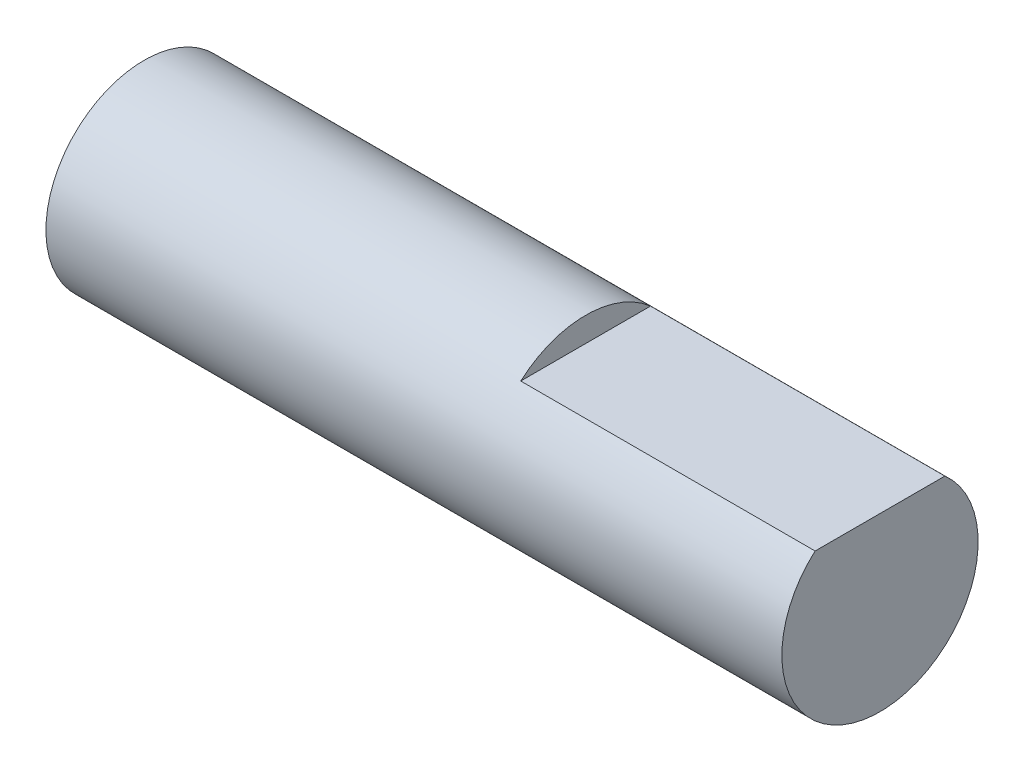
ISO-10303-21;
HEADER;
FILE_DESCRIPTION(('STEP AP214'),'2;1');
FILE_NAME('part.step','',(''),(''),'','','');
FILE_SCHEMA(('AUTOMOTIVE_DESIGN { 1 0 10303 214 1 1 1 1 }'));
ENDSEC;
DATA;
#1=APPLICATION_CONTEXT('core data for automotive mechanical design processes');
#2=APPLICATION_PROTOCOL_DEFINITION('international standard','automotive_design',2000,#1);
#3=PRODUCT_CONTEXT('',#1,'mechanical');
#4=PRODUCT('Part','Part','',(#3));
#5=PRODUCT_RELATED_PRODUCT_CATEGORY('part','',(#4));
#6=PRODUCT_DEFINITION_FORMATION('','',#4);
#7=PRODUCT_DEFINITION_CONTEXT('part definition',#1,'design');
#8=PRODUCT_DEFINITION('design','',#6,#7);
#9=PRODUCT_DEFINITION_SHAPE('','',#8);
#10=(LENGTH_UNIT() NAMED_UNIT(*) SI_UNIT(.MILLI.,.METRE.));
#11=(NAMED_UNIT(*) PLANE_ANGLE_UNIT() SI_UNIT($,.RADIAN.));
#12=(NAMED_UNIT(*) SI_UNIT($,.STERADIAN.) SOLID_ANGLE_UNIT());
#13=UNCERTAINTY_MEASURE_WITH_UNIT(LENGTH_MEASURE(1.E-05),#10,'distance_accuracy_value','');
#14=(GEOMETRIC_REPRESENTATION_CONTEXT(3) GLOBAL_UNCERTAINTY_ASSIGNED_CONTEXT((#13)) GLOBAL_UNIT_ASSIGNED_CONTEXT((#10,
#11,#12)) REPRESENTATION_CONTEXT('',''));
#15=CARTESIAN_POINT('',(0.,0.,0.));
#16=DIRECTION('',(0.,0.,1.));
#17=DIRECTION('',(1.,0.,0.));
#18=AXIS2_PLACEMENT_3D('',#15,#16,#17);
#19=CARTESIAN_POINT('',(30.,0.,0.));
#20=DIRECTION('',(-1.,0.,0.));
#21=DIRECTION('',(0.,0.,1.));
#22=AXIS2_PLACEMENT_3D('',#19,#20,#21);
#23=CYLINDRICAL_SURFACE('',#22,4.);
#24=CARTESIAN_POINT('',(30.,0.,0.));
#25=DIRECTION('',(1.,0.,0.));
#26=DIRECTION('',(0.,0.,-1.));
#27=AXIS2_PLACEMENT_3D('',#24,#25,#26);
#28=CIRCLE('',#27,4.);
#29=CARTESIAN_POINT('',(30.,3.,2.64575131106459));
#30=VERTEX_POINT('',#29);
#31=CARTESIAN_POINT('',(30.,3.,-2.64575131106459));
#32=VERTEX_POINT('',#31);
#33=EDGE_CURVE('E11',#30,#32,#28,.T.);
#34=ORIENTED_EDGE('',*,*,#33,.F.);
#35=DIRECTION('',(1.,0.,0.));
#36=VECTOR('',#35,1.);
#37=CARTESIAN_POINT('',(18.,3.,2.64575131106459));
#38=LINE('',#37,#36);
#39=CARTESIAN_POINT('',(18.,3.,2.64575131106459));
#40=VERTEX_POINT('',#39);
#41=EDGE_CURVE('E61',#40,#30,#38,.T.);
#42=ORIENTED_EDGE('',*,*,#41,.F.);
#43=CARTESIAN_POINT('',(18.,0.,0.));
#44=DIRECTION('',(1.,0.,0.));
#45=DIRECTION('',(0.,0.,1.));
#46=AXIS2_PLACEMENT_3D('',#43,#44,#45);
#47=CIRCLE('',#46,4.);
#48=CARTESIAN_POINT('',(18.,3.,-2.64575131106459));
#49=VERTEX_POINT('',#48);
#50=EDGE_CURVE('E76',#49,#40,#47,.T.);
#51=ORIENTED_EDGE('',*,*,#50,.F.);
#52=DIRECTION('',(1.,0.,0.));
#53=VECTOR('',#52,1.);
#54=CARTESIAN_POINT('',(18.,3.,-2.64575131106459));
#55=LINE('',#54,#53);
#56=EDGE_CURVE('E67',#49,#32,#55,.T.);
#57=ORIENTED_EDGE('',*,*,#56,.T.);
#58=EDGE_LOOP('',(#34,#42,#51,#57));
#59=FACE_BOUND('',#58,.T.);
#60=CARTESIAN_POINT('',(0.,0.,0.));
#61=DIRECTION('',(1.,0.,0.));
#62=DIRECTION('',(0.,0.,-1.));
#63=AXIS2_PLACEMENT_3D('',#60,#61,#62);
#64=CIRCLE('',#63,4.);
#65=CARTESIAN_POINT('',(0.,0.,-4.));
#66=VERTEX_POINT('',#65);
#67=EDGE_CURVE('E50',#66,#66,#64,.T.);
#68=ORIENTED_EDGE('',*,*,#67,.T.);
#69=EDGE_LOOP('',(#68));
#70=FACE_BOUND('',#69,.T.);
#71=ADVANCED_FACE('F47',(#59,#70),#23,.T.);
#72=CARTESIAN_POINT('',(30.,0.,0.));
#73=DIRECTION('',(1.,0.,0.));
#74=DIRECTION('',(0.,0.,-1.));
#75=AXIS2_PLACEMENT_3D('',#72,#73,#74);
#76=PLANE('',#75);
#77=DIRECTION('',(0.,0.,-1.));
#78=VECTOR('',#77,1.);
#79=CARTESIAN_POINT('',(30.,3.,2.64575131106459));
#80=LINE('',#79,#78);
#81=EDGE_CURVE('E72',#30,#32,#80,.T.);
#82=ORIENTED_EDGE('',*,*,#81,.F.);
#83=ORIENTED_EDGE('',*,*,#33,.T.);
#84=EDGE_LOOP('',(#82,#83));
#85=FACE_BOUND('',#84,.T.);
#86=ADVANCED_FACE('F82',(#85),#76,.T.);
#87=CARTESIAN_POINT('',(0.,0.,0.));
#88=DIRECTION('',(1.,0.,0.));
#89=DIRECTION('',(0.,0.,-1.));
#90=AXIS2_PLACEMENT_3D('',#87,#88,#89);
#91=PLANE('',#90);
#92=ORIENTED_EDGE('',*,*,#67,.F.);
#93=EDGE_LOOP('',(#92));
#94=FACE_BOUND('',#93,.T.);
#95=ADVANCED_FACE('F84',(#94),#91,.F.);
#96=CARTESIAN_POINT('',(18.,3.,2.64575131106459));
#97=DIRECTION('',(0.,-1.,0.));
#98=DIRECTION('',(0.,0.,-1.));
#99=AXIS2_PLACEMENT_3D('',#96,#97,#98);
#100=PLANE('',#99);
#101=ORIENTED_EDGE('',*,*,#81,.T.);
#102=ORIENTED_EDGE('',*,*,#56,.F.);
#103=DIRECTION('',(0.,0.,-1.));
#104=VECTOR('',#103,1.);
#105=CARTESIAN_POINT('',(18.,3.,2.64575131106459));
#106=LINE('',#105,#104);
#107=EDGE_CURVE('E99',#40,#49,#106,.T.);
#108=ORIENTED_EDGE('',*,*,#107,.F.);
#109=ORIENTED_EDGE('',*,*,#41,.T.);
#110=EDGE_LOOP('',(#101,#102,#108,#109));
#111=FACE_BOUND('',#110,.T.);
#112=ADVANCED_FACE('F73',(#111),#100,.F.);
#113=CARTESIAN_POINT('',(18.,0.,0.));
#114=DIRECTION('',(-1.,0.,0.));
#115=DIRECTION('',(0.,0.,1.));
#116=AXIS2_PLACEMENT_3D('',#113,#114,#115);
#117=PLANE('',#116);
#118=ORIENTED_EDGE('',*,*,#50,.T.);
#119=ORIENTED_EDGE('',*,*,#107,.T.);
#120=EDGE_LOOP('',(#118,#119));
#121=FACE_BOUND('',#120,.T.);
#122=ADVANCED_FACE('F94',(#121),#117,.F.);
#123=CLOSED_SHELL('',(#71,#86,#95,#112,#122));
#124=MANIFOLD_SOLID_BREP('B2',#123);
#125=ADVANCED_BREP_SHAPE_REPRESENTATION('',(#18,#124),#14);
#126=SHAPE_DEFINITION_REPRESENTATION(#9,#125);
ENDSEC;
END-ISO-10303-21;
